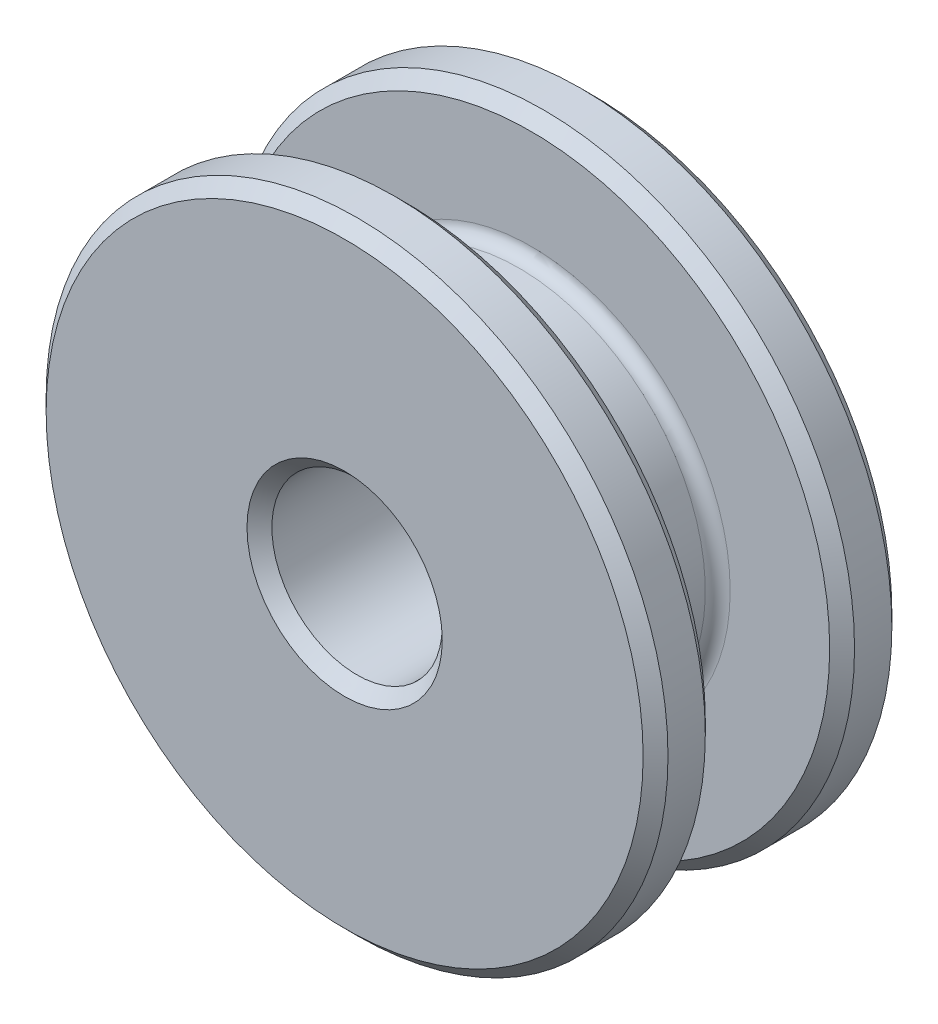
ISO-10303-21;
HEADER;
FILE_DESCRIPTION(('STEP AP214'),'2;1');
FILE_NAME('part.step','',(''),(''),'','','');
FILE_SCHEMA(('AUTOMOTIVE_DESIGN { 1 0 10303 214 1 1 1 1 }'));
ENDSEC;
DATA;
#1=APPLICATION_CONTEXT('core data for automotive mechanical design processes');
#2=APPLICATION_PROTOCOL_DEFINITION('international standard','automotive_design',2000,#1);
#3=PRODUCT_CONTEXT('',#1,'mechanical');
#4=PRODUCT('Part','Part','',(#3));
#5=PRODUCT_RELATED_PRODUCT_CATEGORY('part','',(#4));
#6=PRODUCT_DEFINITION_FORMATION('','',#4);
#7=PRODUCT_DEFINITION_CONTEXT('part definition',#1,'design');
#8=PRODUCT_DEFINITION('design','',#6,#7);
#9=PRODUCT_DEFINITION_SHAPE('','',#8);
#10=(LENGTH_UNIT() NAMED_UNIT(*) SI_UNIT(.MILLI.,.METRE.));
#11=(NAMED_UNIT(*) PLANE_ANGLE_UNIT() SI_UNIT($,.RADIAN.));
#12=(NAMED_UNIT(*) SI_UNIT($,.STERADIAN.) SOLID_ANGLE_UNIT());
#13=UNCERTAINTY_MEASURE_WITH_UNIT(LENGTH_MEASURE(1.E-05),#10,'distance_accuracy_value','');
#14=(GEOMETRIC_REPRESENTATION_CONTEXT(3) GLOBAL_UNCERTAINTY_ASSIGNED_CONTEXT((#13)) GLOBAL_UNIT_ASSIGNED_CONTEXT((#10,
#11,#12)) REPRESENTATION_CONTEXT('',''));
#15=CARTESIAN_POINT('',(0.,0.,0.));
#16=DIRECTION('',(0.,0.,1.));
#17=DIRECTION('',(1.,0.,0.));
#18=AXIS2_PLACEMENT_3D('',#15,#16,#17);
#19=CARTESIAN_POINT('',(0.,0.,10.));
#20=DIRECTION('',(0.,0.,-1.));
#21=DIRECTION('',(-1.,0.,0.));
#22=AXIS2_PLACEMENT_3D('',#19,#20,#21);
#23=CYLINDRICAL_SURFACE('',#22,12.5);
#24=CARTESIAN_POINT('',(0.,0.,0.500000000000007));
#25=DIRECTION('',(0.,0.,1.));
#26=DIRECTION('',(1.,0.,0.));
#27=AXIS2_PLACEMENT_3D('',#24,#25,#26);
#28=CIRCLE('',#27,12.5);
#29=CARTESIAN_POINT('',(12.5,0.,0.500000000000007));
#30=VERTEX_POINT('',#29);
#31=EDGE_CURVE('E75',#30,#30,#28,.T.);
#32=ORIENTED_EDGE('',*,*,#31,.T.);
#33=EDGE_LOOP('',(#32));
#34=FACE_BOUND('',#33,.T.);
#35=CARTESIAN_POINT('',(0.,0.,2.));
#36=DIRECTION('',(0.,0.,-1.));
#37=DIRECTION('',(-1.,0.,0.));
#38=AXIS2_PLACEMENT_3D('',#35,#36,#37);
#39=CIRCLE('',#38,12.5);
#40=CARTESIAN_POINT('',(-12.5,0.,2.));
#41=VERTEX_POINT('',#40);
#42=EDGE_CURVE('E78',#41,#41,#39,.T.);
#43=ORIENTED_EDGE('',*,*,#42,.T.);
#44=EDGE_LOOP('',(#43));
#45=FACE_BOUND('',#44,.T.);
#46=ADVANCED_FACE('F43',(#34,#45),#23,.T.);
#47=CARTESIAN_POINT('',(0.,0.,10.));
#48=DIRECTION('',(0.,0.,-1.));
#49=DIRECTION('',(-1.,0.,0.));
#50=AXIS2_PLACEMENT_3D('',#47,#48,#49);
#51=CYLINDRICAL_SURFACE('',#50,3.425);
#52=CARTESIAN_POINT('',(0.,0.,0.499999999999999));
#53=DIRECTION('',(0.,0.,1.));
#54=DIRECTION('',(1.,0.,0.));
#55=AXIS2_PLACEMENT_3D('',#52,#53,#54);
#56=CIRCLE('',#55,3.425);
#57=CARTESIAN_POINT('',(3.425,0.,0.499999999999999));
#58=VERTEX_POINT('',#57);
#59=EDGE_CURVE('E87',#58,#58,#56,.F.);
#60=ORIENTED_EDGE('',*,*,#59,.T.);
#61=EDGE_LOOP('',(#60));
#62=FACE_BOUND('',#61,.T.);
#63=CARTESIAN_POINT('',(0.,0.,9.49999999999999));
#64=DIRECTION('',(0.,0.,1.));
#65=DIRECTION('',(1.,0.,0.));
#66=AXIS2_PLACEMENT_3D('',#63,#64,#65);
#67=CIRCLE('',#66,3.425);
#68=CARTESIAN_POINT('',(3.425,0.,9.49999999999999));
#69=VERTEX_POINT('',#68);
#70=EDGE_CURVE('E90',#69,#69,#67,.T.);
#71=ORIENTED_EDGE('',*,*,#70,.T.);
#72=EDGE_LOOP('',(#71));
#73=FACE_BOUND('',#72,.T.);
#74=ADVANCED_FACE('F112',(#62,#73),#51,.F.);
#75=CARTESIAN_POINT('',(0.,0.,7.99999999999999));
#76=DIRECTION('',(0.,0.,1.));
#77=DIRECTION('',(1.,0.,0.));
#78=AXIS2_PLACEMENT_3D('',#75,#76,#77);
#79=CIRCLE('',#78,12.5);
#80=CARTESIAN_POINT('',(12.5,0.,7.99999999999999));
#81=VERTEX_POINT('',#80);
#82=EDGE_CURVE('E63',#81,#81,#79,.T.);
#83=ORIENTED_EDGE('',*,*,#82,.T.);
#84=EDGE_LOOP('',(#83));
#85=FACE_BOUND('',#84,.T.);
#86=CARTESIAN_POINT('',(0.,0.,9.49999999999999));
#87=DIRECTION('',(0.,0.,1.));
#88=DIRECTION('',(1.,0.,0.));
#89=AXIS2_PLACEMENT_3D('',#86,#87,#88);
#90=CIRCLE('',#89,12.5);
#91=CARTESIAN_POINT('',(12.5,0.,9.49999999999999));
#92=VERTEX_POINT('',#91);
#93=EDGE_CURVE('E66',#92,#92,#90,.F.);
#94=ORIENTED_EDGE('',*,*,#93,.T.);
#95=EDGE_LOOP('',(#94));
#96=FACE_BOUND('',#95,.T.);
#97=ADVANCED_FACE('F114',(#85,#96),#23,.T.);
#98=CARTESIAN_POINT('',(0.,0.,10.));
#99=DIRECTION('',(0.,0.,1.));
#100=DIRECTION('',(1.,0.,0.));
#101=AXIS2_PLACEMENT_3D('',#98,#99,#100);
#102=PLANE('',#101);
#103=CARTESIAN_POINT('',(0.,0.,10.));
#104=DIRECTION('',(0.,0.,1.));
#105=DIRECTION('',(1.,0.,0.));
#106=AXIS2_PLACEMENT_3D('',#103,#104,#105);
#107=CIRCLE('',#106,3.92500000000001);
#108=CARTESIAN_POINT('',(3.92500000000001,0.,10.));
#109=VERTEX_POINT('',#108);
#110=EDGE_CURVE('E81',#109,#109,#107,.F.);
#111=ORIENTED_EDGE('',*,*,#110,.T.);
#112=EDGE_LOOP('',(#111));
#113=FACE_BOUND('',#112,.T.);
#114=CARTESIAN_POINT('',(0.,0.,10.));
#115=DIRECTION('',(0.,0.,1.));
#116=DIRECTION('',(1.,0.,0.));
#117=AXIS2_PLACEMENT_3D('',#114,#115,#116);
#118=CIRCLE('',#117,12.);
#119=CARTESIAN_POINT('',(12.,0.,10.));
#120=VERTEX_POINT('',#119);
#121=EDGE_CURVE('E84',#120,#120,#118,.T.);
#122=ORIENTED_EDGE('',*,*,#121,.T.);
#123=EDGE_LOOP('',(#122));
#124=FACE_BOUND('',#123,.T.);
#125=ADVANCED_FACE('F164',(#113,#124),#102,.T.);
#126=CARTESIAN_POINT('',(0.,0.,0.));
#127=DIRECTION('',(0.,0.,1.));
#128=DIRECTION('',(1.,0.,0.));
#129=AXIS2_PLACEMENT_3D('',#126,#127,#128);
#130=PLANE('',#129);
#131=CARTESIAN_POINT('',(0.,0.,0.));
#132=DIRECTION('',(0.,0.,1.));
#133=DIRECTION('',(1.,0.,0.));
#134=AXIS2_PLACEMENT_3D('',#131,#132,#133);
#135=CIRCLE('',#134,3.925);
#136=CARTESIAN_POINT('',(3.925,0.,0.));
#137=VERTEX_POINT('',#136);
#138=EDGE_CURVE('E93',#137,#137,#135,.T.);
#139=ORIENTED_EDGE('',*,*,#138,.T.);
#140=EDGE_LOOP('',(#139));
#141=FACE_BOUND('',#140,.T.);
#142=CARTESIAN_POINT('',(0.,0.,0.));
#143=DIRECTION('',(0.,0.,1.));
#144=DIRECTION('',(1.,0.,0.));
#145=AXIS2_PLACEMENT_3D('',#142,#143,#144);
#146=CIRCLE('',#145,12.);
#147=CARTESIAN_POINT('',(12.,0.,0.));
#148=VERTEX_POINT('',#147);
#149=EDGE_CURVE('E96',#148,#148,#146,.F.);
#150=ORIENTED_EDGE('',*,*,#149,.T.);
#151=EDGE_LOOP('',(#150));
#152=FACE_BOUND('',#151,.T.);
#153=ADVANCED_FACE('F100',(#141,#152),#130,.F.);
#154=CARTESIAN_POINT('',(-7.5,0.,2.5));
#155=DIRECTION('',(0.,0.,-1.));
#156=DIRECTION('',(-1.,0.,0.));
#157=AXIS2_PLACEMENT_3D('',#154,#155,#156);
#158=PLANE('',#157);
#159=CARTESIAN_POINT('',(0.,0.,2.5));
#160=DIRECTION('',(0.,0.,-1.));
#161=DIRECTION('',(-1.,0.,0.));
#162=AXIS2_PLACEMENT_3D('',#159,#160,#161);
#163=CIRCLE('',#162,8.);
#164=CARTESIAN_POINT('',(-8.,0.,2.5));
#165=VERTEX_POINT('',#164);
#166=EDGE_CURVE('E58',#165,#165,#163,.T.);
#167=ORIENTED_EDGE('',*,*,#166,.T.);
#168=EDGE_LOOP('',(#167));
#169=FACE_BOUND('',#168,.T.);
#170=CARTESIAN_POINT('',(0.,0.,2.5));
#171=DIRECTION('',(0.,0.,-1.));
#172=DIRECTION('',(-1.,0.,0.));
#173=AXIS2_PLACEMENT_3D('',#170,#171,#172);
#174=CIRCLE('',#173,12.);
#175=CARTESIAN_POINT('',(-12.,0.,2.5));
#176=VERTEX_POINT('',#175);
#177=EDGE_CURVE('E72',#176,#176,#174,.F.);
#178=ORIENTED_EDGE('',*,*,#177,.T.);
#179=EDGE_LOOP('',(#178));
#180=FACE_BOUND('',#179,.T.);
#181=ADVANCED_FACE('F153',(#169,#180),#158,.F.);
#182=CARTESIAN_POINT('',(-12.5,0.,7.5));
#183=DIRECTION('',(0.,0.,1.));
#184=DIRECTION('',(1.,0.,0.));
#185=AXIS2_PLACEMENT_3D('',#182,#183,#184);
#186=PLANE('',#185);
#187=CARTESIAN_POINT('',(0.,0.,7.5));
#188=DIRECTION('',(0.,0.,1.));
#189=DIRECTION('',(1.,0.,0.));
#190=AXIS2_PLACEMENT_3D('',#187,#188,#189);
#191=CIRCLE('',#190,8.);
#192=CARTESIAN_POINT('',(8.,0.,7.5));
#193=VERTEX_POINT('',#192);
#194=EDGE_CURVE('E10',#193,#193,#191,.T.);
#195=ORIENTED_EDGE('',*,*,#194,.T.);
#196=EDGE_LOOP('',(#195));
#197=FACE_BOUND('',#196,.T.);
#198=CARTESIAN_POINT('',(0.,0.,7.5));
#199=DIRECTION('',(0.,0.,1.));
#200=DIRECTION('',(1.,0.,0.));
#201=AXIS2_PLACEMENT_3D('',#198,#199,#200);
#202=CIRCLE('',#201,12.);
#203=CARTESIAN_POINT('',(12.,0.,7.5));
#204=VERTEX_POINT('',#203);
#205=EDGE_CURVE('E69',#204,#204,#202,.F.);
#206=ORIENTED_EDGE('',*,*,#205,.T.);
#207=EDGE_LOOP('',(#206));
#208=FACE_BOUND('',#207,.T.);
#209=ADVANCED_FACE('F156',(#197,#208),#186,.F.);
#210=CARTESIAN_POINT('',(0.,0.,0.));
#211=DIRECTION('',(0.,0.,-1.));
#212=DIRECTION('',(-1.,0.,0.));
#213=AXIS2_PLACEMENT_3D('',#210,#211,#212);
#214=CYLINDRICAL_SURFACE('',#213,7.5);
#215=CARTESIAN_POINT('',(0.,0.,3.));
#216=DIRECTION('',(0.,0.,-1.));
#217=DIRECTION('',(-1.,0.,0.));
#218=AXIS2_PLACEMENT_3D('',#215,#216,#217);
#219=CIRCLE('',#218,7.5);
#220=CARTESIAN_POINT('',(-7.5,0.,3.));
#221=VERTEX_POINT('',#220);
#222=EDGE_CURVE('E50',#221,#221,#219,.F.);
#223=ORIENTED_EDGE('',*,*,#222,.T.);
#224=EDGE_LOOP('',(#223));
#225=FACE_BOUND('',#224,.T.);
#226=CARTESIAN_POINT('',(0.,0.,7.));
#227=DIRECTION('',(0.,0.,1.));
#228=DIRECTION('',(1.,0.,0.));
#229=AXIS2_PLACEMENT_3D('',#226,#227,#228);
#230=CIRCLE('',#229,7.5);
#231=CARTESIAN_POINT('',(7.5,0.,7.));
#232=VERTEX_POINT('',#231);
#233=EDGE_CURVE('E54',#232,#232,#230,.F.);
#234=ORIENTED_EDGE('',*,*,#233,.T.);
#235=EDGE_LOOP('',(#234));
#236=FACE_BOUND('',#235,.T.);
#237=ADVANCED_FACE('F161',(#225,#236),#214,.T.);
#238=CARTESIAN_POINT('',(0.,0.,0.));
#239=DIRECTION('',(0.,0.,-1.));
#240=DIRECTION('',(-1.,0.,0.));
#241=AXIS2_PLACEMENT_3D('',#238,#239,#240);
#242=CONICAL_SURFACE('',#241,3.925,0.785398163397447);
#243=ORIENTED_EDGE('',*,*,#59,.F.);
#244=EDGE_LOOP('',(#243));
#245=FACE_BOUND('',#244,.T.);
#246=ORIENTED_EDGE('',*,*,#138,.F.);
#247=EDGE_LOOP('',(#246));
#248=FACE_BOUND('',#247,.T.);
#249=ADVANCED_FACE('F178',(#245,#248),#242,.F.);
#250=CARTESIAN_POINT('',(0.,0.,9.49999999999999));
#251=DIRECTION('',(0.,0.,1.));
#252=DIRECTION('',(1.,0.,0.));
#253=AXIS2_PLACEMENT_3D('',#250,#251,#252);
#254=CONICAL_SURFACE('',#253,3.425,0.785398163397451);
#255=ORIENTED_EDGE('',*,*,#110,.F.);
#256=EDGE_LOOP('',(#255));
#257=FACE_BOUND('',#256,.T.);
#258=ORIENTED_EDGE('',*,*,#70,.F.);
#259=EDGE_LOOP('',(#258));
#260=FACE_BOUND('',#259,.T.);
#261=ADVANCED_FACE('F106',(#257,#260),#254,.F.);
#262=CARTESIAN_POINT('',(0.,0.,0.500000000000007));
#263=DIRECTION('',(0.,0.,1.));
#264=DIRECTION('',(1.,0.,0.));
#265=AXIS2_PLACEMENT_3D('',#262,#263,#264);
#266=CONICAL_SURFACE('',#265,12.5,0.785398163397448);
#267=ORIENTED_EDGE('',*,*,#149,.F.);
#268=EDGE_LOOP('',(#267));
#269=FACE_BOUND('',#268,.T.);
#270=ORIENTED_EDGE('',*,*,#31,.F.);
#271=EDGE_LOOP('',(#270));
#272=FACE_BOUND('',#271,.T.);
#273=ADVANCED_FACE('F102',(#269,#272),#266,.T.);
#274=CARTESIAN_POINT('',(0.,0.,2.));
#275=DIRECTION('',(0.,0.,-1.));
#276=DIRECTION('',(-1.,0.,0.));
#277=AXIS2_PLACEMENT_3D('',#274,#275,#276);
#278=CONICAL_SURFACE('',#277,12.5,0.785398163397447);
#279=ORIENTED_EDGE('',*,*,#177,.F.);
#280=EDGE_LOOP('',(#279));
#281=FACE_BOUND('',#280,.T.);
#282=ORIENTED_EDGE('',*,*,#42,.F.);
#283=EDGE_LOOP('',(#282));
#284=FACE_BOUND('',#283,.T.);
#285=ADVANCED_FACE('F105',(#281,#284),#278,.T.);
#286=CARTESIAN_POINT('',(0.,0.,7.5));
#287=DIRECTION('',(0.,0.,1.));
#288=DIRECTION('',(1.,0.,0.));
#289=AXIS2_PLACEMENT_3D('',#286,#287,#288);
#290=CONICAL_SURFACE('',#289,12.,0.785398163397453);
#291=ORIENTED_EDGE('',*,*,#82,.F.);
#292=EDGE_LOOP('',(#291));
#293=FACE_BOUND('',#292,.T.);
#294=ORIENTED_EDGE('',*,*,#205,.F.);
#295=EDGE_LOOP('',(#294));
#296=FACE_BOUND('',#295,.T.);
#297=ADVANCED_FACE('F118',(#293,#296),#290,.T.);
#298=CARTESIAN_POINT('',(0.,0.,10.));
#299=DIRECTION('',(0.,0.,-1.));
#300=DIRECTION('',(-1.,0.,0.));
#301=AXIS2_PLACEMENT_3D('',#298,#299,#300);
#302=CONICAL_SURFACE('',#301,12.,0.785398163397443);
#303=ORIENTED_EDGE('',*,*,#93,.F.);
#304=EDGE_LOOP('',(#303));
#305=FACE_BOUND('',#304,.T.);
#306=ORIENTED_EDGE('',*,*,#121,.F.);
#307=EDGE_LOOP('',(#306));
#308=FACE_BOUND('',#307,.T.);
#309=ADVANCED_FACE('F124',(#305,#308),#302,.T.);
#310=CARTESIAN_POINT('',(0.,0.,3.));
#311=DIRECTION('',(0.,0.,-1.));
#312=DIRECTION('',(-1.,0.,0.));
#313=AXIS2_PLACEMENT_3D('',#310,#311,#312);
#314=TOROIDAL_SURFACE('',#313,8.,0.5);
#315=ORIENTED_EDGE('',*,*,#222,.F.);
#316=EDGE_LOOP('',(#315));
#317=FACE_BOUND('',#316,.T.);
#318=ORIENTED_EDGE('',*,*,#166,.F.);
#319=EDGE_LOOP('',(#318));
#320=FACE_BOUND('',#319,.T.);
#321=ADVANCED_FACE('F141',(#317,#320),#314,.F.);
#322=CARTESIAN_POINT('',(0.,0.,7.));
#323=DIRECTION('',(0.,0.,1.));
#324=DIRECTION('',(1.,0.,0.));
#325=AXIS2_PLACEMENT_3D('',#322,#323,#324);
#326=TOROIDAL_SURFACE('',#325,8.,0.5);
#327=ORIENTED_EDGE('',*,*,#194,.F.);
#328=EDGE_LOOP('',(#327));
#329=FACE_BOUND('',#328,.T.);
#330=ORIENTED_EDGE('',*,*,#233,.F.);
#331=EDGE_LOOP('',(#330));
#332=FACE_BOUND('',#331,.T.);
#333=ADVANCED_FACE('F45',(#329,#332),#326,.F.);
#334=CLOSED_SHELL('',(#46,#74,#97,#125,#153,#181,#209,#237,#249,#261,#273,#285,#297,#309,#321,#333));
#335=MANIFOLD_SOLID_BREP('B2',#334);
#336=ADVANCED_BREP_SHAPE_REPRESENTATION('',(#18,#335),#14);
#337=SHAPE_DEFINITION_REPRESENTATION(#9,#336);
ENDSEC;
END-ISO-10303-21;
